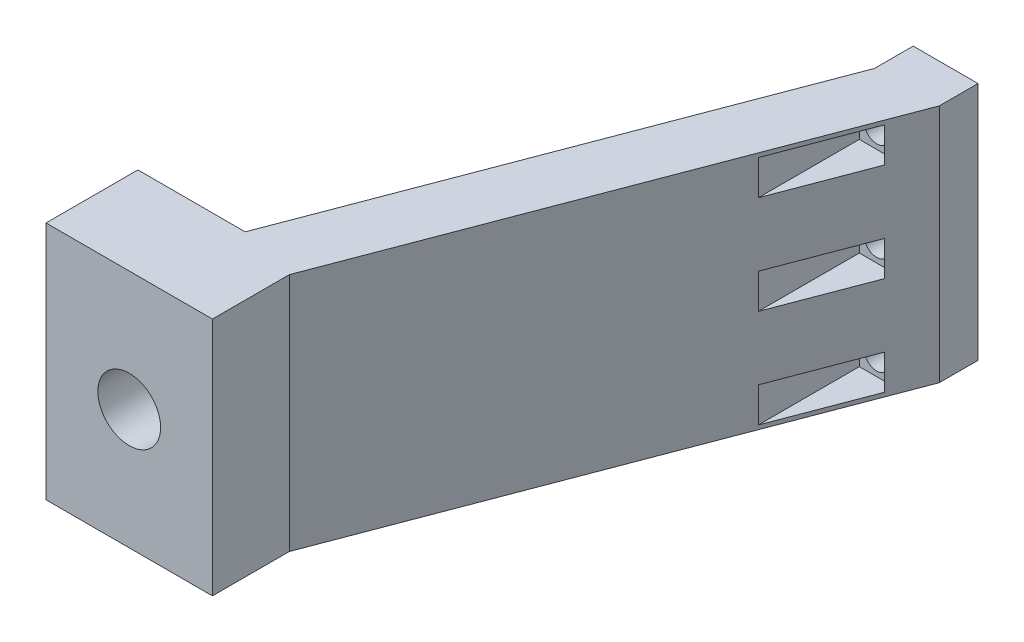
ISO-10303-21;
HEADER;
FILE_DESCRIPTION(('STEP AP214'),'2;1');
FILE_NAME('part.step','',(''),(''),'','','');
FILE_SCHEMA(('AUTOMOTIVE_DESIGN { 1 0 10303 214 1 1 1 1 }'));
ENDSEC;
DATA;
#1=APPLICATION_CONTEXT('core data for automotive mechanical design processes');
#2=APPLICATION_PROTOCOL_DEFINITION('international standard','automotive_design',2000,#1);
#3=PRODUCT_CONTEXT('',#1,'mechanical');
#4=PRODUCT('Part','Part','',(#3));
#5=PRODUCT_RELATED_PRODUCT_CATEGORY('part','',(#4));
#6=PRODUCT_DEFINITION_FORMATION('','',#4);
#7=PRODUCT_DEFINITION_CONTEXT('part definition',#1,'design');
#8=PRODUCT_DEFINITION('design','',#6,#7);
#9=PRODUCT_DEFINITION_SHAPE('','',#8);
#10=(LENGTH_UNIT() NAMED_UNIT(*) SI_UNIT(.MILLI.,.METRE.));
#11=(NAMED_UNIT(*) PLANE_ANGLE_UNIT() SI_UNIT($,.RADIAN.));
#12=(NAMED_UNIT(*) SI_UNIT($,.STERADIAN.) SOLID_ANGLE_UNIT());
#13=UNCERTAINTY_MEASURE_WITH_UNIT(LENGTH_MEASURE(1.E-05),#10,'distance_accuracy_value','');
#14=(GEOMETRIC_REPRESENTATION_CONTEXT(3) GLOBAL_UNCERTAINTY_ASSIGNED_CONTEXT((#13)) GLOBAL_UNIT_ASSIGNED_CONTEXT((#10,
#11,#12)) REPRESENTATION_CONTEXT('',''));
#15=CARTESIAN_POINT('',(0.,0.,0.));
#16=DIRECTION('',(0.,0.,1.));
#17=DIRECTION('',(1.,0.,0.));
#18=AXIS2_PLACEMENT_3D('',#15,#16,#17);
#19=CARTESIAN_POINT('',(182.027314729737,-38.1,121.14294460415));
#20=DIRECTION('',(0.,0.,1.));
#21=DIRECTION('',(1.,0.,0.));
#22=AXIS2_PLACEMENT_3D('',#19,#20,#21);
#23=CYLINDRICAL_SURFACE('',#22,3.75000000000001);
#24=CARTESIAN_POINT('',(182.027314729737,-38.1,127.74240555955));
#25=DIRECTION('',(0.,0.,-1.));
#26=DIRECTION('',(-1.,0.,0.));
#27=AXIS2_PLACEMENT_3D('',#24,#25,#26);
#28=CIRCLE('',#27,3.75000000000001);
#29=CARTESIAN_POINT('',(178.277314729737,-38.1,127.74240555955));
#30=VERTEX_POINT('',#29);
#31=EDGE_CURVE('E222',#30,#30,#28,.T.);
#32=ORIENTED_EDGE('',*,*,#31,.T.);
#33=EDGE_LOOP('',(#32));
#34=FACE_BOUND('',#33,.T.);
#35=CARTESIAN_POINT('',(182.027314729737,-38.1,131.46294460415));
#36=DIRECTION('',(0.,0.,1.));
#37=DIRECTION('',(1.,0.,0.));
#38=AXIS2_PLACEMENT_3D('',#35,#36,#37);
#39=CIRCLE('',#38,3.75000000000001);
#40=CARTESIAN_POINT('',(185.777314729737,-38.1,131.46294460415));
#41=VERTEX_POINT('',#40);
#42=EDGE_CURVE('E47',#41,#41,#39,.F.);
#43=ORIENTED_EDGE('',*,*,#42,.F.);
#44=EDGE_LOOP('',(#43));
#45=FACE_BOUND('',#44,.T.);
#46=ADVANCED_FACE('F43',(#34,#45),#23,.F.);
#47=CARTESIAN_POINT('',(249.665385215949,160.042390935063,10.));
#48=DIRECTION('',(0.934931103440882,0.,0.354829299549538));
#49=DIRECTION('',(0.354829299549538,0.,-0.934931103440882));
#50=AXIS2_PLACEMENT_3D('',#47,#48,#49);
#51=PLANE('',#50);
#52=DIRECTION('',(-0.354829299549538,0.,0.934931103440882));
#53=VECTOR('',#52,1.);
#54=CARTESIAN_POINT('',(249.665385215949,-42.5884167770716,10.));
#55=LINE('',#54,#53);
#56=CARTESIAN_POINT('',(245.788416777072,-42.5884167770716,20.2153299774481));
#57=VERTEX_POINT('',#56);
#58=CARTESIAN_POINT('',(236.811583222928,-42.5884167770716,43.8681706837683));
#59=VERTEX_POINT('',#58);
#60=EDGE_CURVE('E428',#57,#59,#55,.T.);
#61=ORIENTED_EDGE('',*,*,#60,.T.);
#62=DIRECTION('',(0.,1.,0.));
#63=VECTOR('',#62,1.);
#64=CARTESIAN_POINT('',(236.811583222928,160.042390935063,43.8681706837682));
#65=LINE('',#64,#63);
#66=CARTESIAN_POINT('',(236.811583222928,-33.6115832229283,43.8681706837683));
#67=VERTEX_POINT('',#66);
#68=EDGE_CURVE('E432',#59,#67,#65,.T.);
#69=ORIENTED_EDGE('',*,*,#68,.T.);
#70=DIRECTION('',(0.354829299549538,0.,-0.934931103440882));
#71=VECTOR('',#70,1.);
#72=CARTESIAN_POINT('',(249.665385215949,-33.6115832229283,10.));
#73=LINE('',#72,#71);
#74=CARTESIAN_POINT('',(245.788416777072,-33.6115832229283,20.2153299774481));
#75=VERTEX_POINT('',#74);
#76=EDGE_CURVE('E420',#67,#75,#73,.T.);
#77=ORIENTED_EDGE('',*,*,#76,.T.);
#78=DIRECTION('',(0.,-1.,0.));
#79=VECTOR('',#78,1.);
#80=CARTESIAN_POINT('',(245.788416777072,160.042390935063,20.2153299774481));
#81=LINE('',#80,#79);
#82=EDGE_CURVE('E424',#75,#57,#81,.T.);
#83=ORIENTED_EDGE('',*,*,#82,.T.);
#84=EDGE_LOOP('',(#61,#69,#77,#83));
#85=FACE_BOUND('',#84,.T.);
#86=DIRECTION('',(0.354829299549538,0.,-0.934931103440882));
#87=VECTOR('',#86,1.);
#88=CARTESIAN_POINT('',(249.665385215949,-7.1526177093732,10.));
#89=LINE('',#88,#87);
#90=CARTESIAN_POINT('',(203.509422764083,-7.15261770937314,131.615224448156));
#91=VERTEX_POINT('',#90);
#92=CARTESIAN_POINT('',(249.665385215949,-7.1526177093732,10.));
#93=VERTEX_POINT('',#92);
#94=EDGE_CURVE('E316',#91,#93,#89,.T.);
#95=ORIENTED_EDGE('',*,*,#94,.F.);
#96=DIRECTION('',(0.,-1.,0.));
#97=VECTOR('',#96,1.);
#98=CARTESIAN_POINT('',(203.509422764083,160.042390935063,131.615224448156));
#99=LINE('',#98,#97);
#100=CARTESIAN_POINT('',(203.509422764083,-69.0473822906268,131.615224448156));
#101=VERTEX_POINT('',#100);
#102=EDGE_CURVE('E340',#91,#101,#99,.T.);
#103=ORIENTED_EDGE('',*,*,#102,.T.);
#104=DIRECTION('',(-0.354829299549538,0.,0.934931103440882));
#105=VECTOR('',#104,1.);
#106=CARTESIAN_POINT('',(249.665385215949,-69.0473822906268,10.));
#107=LINE('',#106,#105);
#108=CARTESIAN_POINT('',(249.665385215949,-69.0473822906268,10.));
#109=VERTEX_POINT('',#108);
#110=EDGE_CURVE('E290',#109,#101,#107,.T.);
#111=ORIENTED_EDGE('',*,*,#110,.F.);
#112=DIRECTION('',(0.,1.,0.));
#113=VECTOR('',#112,1.);
#114=CARTESIAN_POINT('',(249.665385215949,-69.0473822906268,10.));
#115=LINE('',#114,#113);
#116=EDGE_CURVE('E362',#109,#93,#115,.T.);
#117=ORIENTED_EDGE('',*,*,#116,.T.);
#118=EDGE_LOOP('',(#95,#103,#111,#117));
#119=FACE_BOUND('',#118,.T.);
#120=DIRECTION('',(-0.354829299549538,0.,0.934931103440882));
#121=VECTOR('',#120,1.);
#122=CARTESIAN_POINT('',(249.665385215949,-17.1884167770716,10.));
#123=LINE('',#122,#121);
#124=CARTESIAN_POINT('',(245.788416777072,-17.1884167770716,20.2153299774481));
#125=VERTEX_POINT('',#124);
#126=CARTESIAN_POINT('',(236.811583222928,-17.1884167770716,43.8681706837683));
#127=VERTEX_POINT('',#126);
#128=EDGE_CURVE('E412',#125,#127,#123,.T.);
#129=ORIENTED_EDGE('',*,*,#128,.T.);
#130=DIRECTION('',(0.,1.,0.));
#131=VECTOR('',#130,1.);
#132=CARTESIAN_POINT('',(236.811583222928,160.042390935063,43.8681706837682));
#133=LINE('',#132,#131);
#134=CARTESIAN_POINT('',(236.811583222928,-8.21158322292831,43.8681706837683));
#135=VERTEX_POINT('',#134);
#136=EDGE_CURVE('E416',#127,#135,#133,.T.);
#137=ORIENTED_EDGE('',*,*,#136,.T.);
#138=DIRECTION('',(0.354829299549538,0.,-0.934931103440882));
#139=VECTOR('',#138,1.);
#140=CARTESIAN_POINT('',(249.665385215949,-8.21158322292831,9.99999999999999));
#141=LINE('',#140,#139);
#142=CARTESIAN_POINT('',(245.788416777072,-8.21158322292831,20.2153299774481));
#143=VERTEX_POINT('',#142);
#144=EDGE_CURVE('E394',#135,#143,#141,.T.);
#145=ORIENTED_EDGE('',*,*,#144,.T.);
#146=DIRECTION('',(0.,-1.,0.));
#147=VECTOR('',#146,1.);
#148=CARTESIAN_POINT('',(245.788416777072,160.042390935063,20.2153299774467));
#149=LINE('',#148,#147);
#150=EDGE_CURVE('E408',#143,#125,#149,.T.);
#151=ORIENTED_EDGE('',*,*,#150,.T.);
#152=EDGE_LOOP('',(#129,#137,#145,#151));
#153=FACE_BOUND('',#152,.T.);
#154=DIRECTION('',(-0.354829299549538,0.,0.934931103440882));
#155=VECTOR('',#154,1.);
#156=CARTESIAN_POINT('',(249.665385215949,-67.9884167770716,10.));
#157=LINE('',#156,#155);
#158=CARTESIAN_POINT('',(245.788416777072,-67.9884167770716,20.2153299774481));
#159=VERTEX_POINT('',#158);
#160=CARTESIAN_POINT('',(236.811583222928,-67.9884167770716,43.8681706837683));
#161=VERTEX_POINT('',#160);
#162=EDGE_CURVE('E53',#159,#161,#157,.T.);
#163=ORIENTED_EDGE('',*,*,#162,.T.);
#164=DIRECTION('',(0.,1.,0.));
#165=VECTOR('',#164,1.);
#166=CARTESIAN_POINT('',(236.811583222928,160.042390935063,43.8681706837682));
#167=LINE('',#166,#165);
#168=CARTESIAN_POINT('',(236.811583222928,-59.0115832229283,43.8681706837683));
#169=VERTEX_POINT('',#168);
#170=EDGE_CURVE('E11',#161,#169,#167,.T.);
#171=ORIENTED_EDGE('',*,*,#170,.T.);
#172=DIRECTION('',(0.354829299549538,0.,-0.934931103440882));
#173=VECTOR('',#172,1.);
#174=CARTESIAN_POINT('',(249.665385215949,-59.0115832229283,10.));
#175=LINE('',#174,#173);
#176=CARTESIAN_POINT('',(245.788416777072,-59.0115832229283,20.2153299774482));
#177=VERTEX_POINT('',#176);
#178=EDGE_CURVE('E436',#169,#177,#175,.T.);
#179=ORIENTED_EDGE('',*,*,#178,.T.);
#180=DIRECTION('',(0.,-1.,0.));
#181=VECTOR('',#180,1.);
#182=CARTESIAN_POINT('',(245.788416777071,160.042390935063,20.2153299774499));
#183=LINE('',#182,#181);
#184=EDGE_CURVE('E440',#177,#159,#183,.T.);
#185=ORIENTED_EDGE('',*,*,#184,.T.);
#186=EDGE_LOOP('',(#163,#171,#179,#185));
#187=FACE_BOUND('',#186,.T.);
#188=ADVANCED_FACE('F446',(#85,#119,#153,#187),#51,.T.);
#189=CARTESIAN_POINT('',(241.3,-38.1,151.46294460415));
#190=DIRECTION('',(0.,0.,-1.));
#191=DIRECTION('',(-1.,0.,0.));
#192=AXIS2_PLACEMENT_3D('',#189,#190,#191);
#193=CYLINDRICAL_SURFACE('',#192,3.22777378978186);
#194=CARTESIAN_POINT('',(241.3,-38.1,0.));
#195=DIRECTION('',(0.,0.,-1.));
#196=DIRECTION('',(-1.,0.,0.));
#197=AXIS2_PLACEMENT_3D('',#194,#195,#196);
#198=CIRCLE('',#197,3.22777378978186);
#199=CARTESIAN_POINT('',(238.072226210218,-38.1,0.));
#200=VERTEX_POINT('',#199);
#201=EDGE_CURVE('E291',#200,#200,#198,.T.);
#202=ORIENTED_EDGE('',*,*,#201,.T.);
#203=EDGE_LOOP('',(#202));
#204=FACE_BOUND('',#203,.T.);
#205=CARTESIAN_POINT('',(241.3,-38.1,17.78));
#206=DIRECTION('',(0.,0.,1.));
#207=DIRECTION('',(1.,0.,0.));
#208=AXIS2_PLACEMENT_3D('',#205,#206,#207);
#209=CIRCLE('',#208,3.22777378978186);
#210=CARTESIAN_POINT('',(244.527773789782,-38.1,17.78));
#211=VERTEX_POINT('',#210);
#212=EDGE_CURVE('E398',#211,#211,#209,.F.);
#213=ORIENTED_EDGE('',*,*,#212,.F.);
#214=EDGE_LOOP('',(#213));
#215=FACE_BOUND('',#214,.T.);
#216=ADVANCED_FACE('F468',(#204,#215),#193,.F.);
#217=CARTESIAN_POINT('',(241.3,-63.5,151.46294460415));
#218=DIRECTION('',(0.,0.,-1.));
#219=DIRECTION('',(-1.,0.,0.));
#220=AXIS2_PLACEMENT_3D('',#217,#218,#219);
#221=CYLINDRICAL_SURFACE('',#220,3.22777378978186);
#222=CARTESIAN_POINT('',(241.3,-63.5,0.));
#223=DIRECTION('',(0.,0.,-1.));
#224=DIRECTION('',(-1.,0.,0.));
#225=AXIS2_PLACEMENT_3D('',#222,#223,#224);
#226=CIRCLE('',#225,3.22777378978186);
#227=CARTESIAN_POINT('',(238.072226210218,-63.5,0.));
#228=VERTEX_POINT('',#227);
#229=EDGE_CURVE('E286',#228,#228,#226,.T.);
#230=ORIENTED_EDGE('',*,*,#229,.T.);
#231=EDGE_LOOP('',(#230));
#232=FACE_BOUND('',#231,.T.);
#233=CARTESIAN_POINT('',(241.3,-63.5,17.78));
#234=DIRECTION('',(0.,0.,1.));
#235=DIRECTION('',(1.,0.,0.));
#236=AXIS2_PLACEMENT_3D('',#233,#234,#235);
#237=CIRCLE('',#236,3.22777378978186);
#238=CARTESIAN_POINT('',(244.527773789782,-63.5,17.78));
#239=VERTEX_POINT('',#238);
#240=EDGE_CURVE('E197',#239,#239,#237,.F.);
#241=ORIENTED_EDGE('',*,*,#240,.F.);
#242=EDGE_LOOP('',(#241));
#243=FACE_BOUND('',#242,.T.);
#244=ADVANCED_FACE('F515',(#232,#243),#221,.F.);
#245=CARTESIAN_POINT('',(0.,0.,0.));
#246=DIRECTION('',(0.,0.,-1.));
#247=DIRECTION('',(-1.,0.,0.));
#248=AXIS2_PLACEMENT_3D('',#245,#246,#247);
#249=PLANE('',#248);
#250=ORIENTED_EDGE('',*,*,#229,.F.);
#251=EDGE_LOOP('',(#250));
#252=FACE_BOUND('',#251,.T.);
#253=ORIENTED_EDGE('',*,*,#201,.F.);
#254=EDGE_LOOP('',(#253));
#255=FACE_BOUND('',#254,.T.);
#256=CARTESIAN_POINT('',(241.3,-12.7,0.));
#257=DIRECTION('',(0.,0.,-1.));
#258=DIRECTION('',(-1.,0.,0.));
#259=AXIS2_PLACEMENT_3D('',#256,#257,#258);
#260=CIRCLE('',#259,3.22777378978186);
#261=CARTESIAN_POINT('',(238.072226210218,-12.7,0.));
#262=VERTEX_POINT('',#261);
#263=EDGE_CURVE('E295',#262,#262,#260,.T.);
#264=ORIENTED_EDGE('',*,*,#263,.F.);
#265=EDGE_LOOP('',(#264));
#266=FACE_BOUND('',#265,.T.);
#267=DIRECTION('',(0.,-1.,0.));
#268=VECTOR('',#267,1.);
#269=CARTESIAN_POINT('',(232.934614784051,-69.0473822906268,0.));
#270=LINE('',#269,#268);
#271=CARTESIAN_POINT('',(232.934614784051,-7.1526177093732,0.));
#272=VERTEX_POINT('',#271);
#273=CARTESIAN_POINT('',(232.934614784051,-69.0473822906268,0.));
#274=VERTEX_POINT('',#273);
#275=EDGE_CURVE('E357',#272,#274,#270,.T.);
#276=ORIENTED_EDGE('',*,*,#275,.F.);
#277=DIRECTION('',(-1.,0.,0.));
#278=VECTOR('',#277,1.);
#279=CARTESIAN_POINT('',(232.934614784051,-7.1526177093732,0.));
#280=LINE('',#279,#278);
#281=CARTESIAN_POINT('',(249.665385215949,-7.1526177093732,0.));
#282=VERTEX_POINT('',#281);
#283=EDGE_CURVE('E363',#282,#272,#280,.T.);
#284=ORIENTED_EDGE('',*,*,#283,.F.);
#285=DIRECTION('',(0.,1.,0.));
#286=VECTOR('',#285,1.);
#287=CARTESIAN_POINT('',(249.665385215949,-69.0473822906268,0.));
#288=LINE('',#287,#286);
#289=CARTESIAN_POINT('',(249.665385215949,-69.0473822906268,0.));
#290=VERTEX_POINT('',#289);
#291=EDGE_CURVE('E374',#290,#282,#288,.T.);
#292=ORIENTED_EDGE('',*,*,#291,.F.);
#293=DIRECTION('',(1.,0.,0.));
#294=VECTOR('',#293,1.);
#295=CARTESIAN_POINT('',(232.934614784051,-69.0473822906268,0.));
#296=LINE('',#295,#294);
#297=EDGE_CURVE('E371',#274,#290,#296,.T.);
#298=ORIENTED_EDGE('',*,*,#297,.F.);
#299=EDGE_LOOP('',(#276,#284,#292,#298));
#300=FACE_BOUND('',#299,.T.);
#301=ADVANCED_FACE('F512',(#252,#255,#266,#300),#249,.T.);
#302=CARTESIAN_POINT('',(232.934614784051,-69.0473822906268,10.));
#303=DIRECTION('',(1.,0.,0.));
#304=DIRECTION('',(0.,0.,-1.));
#305=AXIS2_PLACEMENT_3D('',#302,#303,#304);
#306=PLANE('',#305);
#307=ORIENTED_EDGE('',*,*,#275,.T.);
#308=DIRECTION('',(0.,0.,-1.));
#309=VECTOR('',#308,1.);
#310=CARTESIAN_POINT('',(232.934614784051,-69.0473822906268,10.));
#311=LINE('',#310,#309);
#312=CARTESIAN_POINT('',(232.934614784051,-69.0473822906268,10.));
#313=VERTEX_POINT('',#312);
#314=EDGE_CURVE('E390',#313,#274,#311,.T.);
#315=ORIENTED_EDGE('',*,*,#314,.F.);
#316=DIRECTION('',(0.,-1.,0.));
#317=VECTOR('',#316,1.);
#318=CARTESIAN_POINT('',(232.934614784051,-69.0473822906268,10.));
#319=LINE('',#318,#317);
#320=CARTESIAN_POINT('',(232.934614784051,-7.1526177093732,10.));
#321=VERTEX_POINT('',#320);
#322=EDGE_CURVE('E358',#321,#313,#319,.T.);
#323=ORIENTED_EDGE('',*,*,#322,.F.);
#324=DIRECTION('',(0.,0.,-1.));
#325=VECTOR('',#324,1.);
#326=CARTESIAN_POINT('',(232.934614784051,-7.1526177093732,10.));
#327=LINE('',#326,#325);
#328=EDGE_CURVE('E367',#321,#272,#327,.T.);
#329=ORIENTED_EDGE('',*,*,#328,.T.);
#330=EDGE_LOOP('',(#307,#315,#323,#329));
#331=FACE_BOUND('',#330,.T.);
#332=ADVANCED_FACE('F45',(#331),#306,.F.);
#333=CARTESIAN_POINT('',(232.934614784051,-69.0473822906268,10.));
#334=DIRECTION('',(0.,1.,0.));
#335=DIRECTION('',(0.,0.,1.));
#336=AXIS2_PLACEMENT_3D('',#333,#334,#335);
#337=PLANE('',#336);
#338=ORIENTED_EDGE('',*,*,#297,.T.);
#339=DIRECTION('',(0.,0.,-1.));
#340=VECTOR('',#339,1.);
#341=CARTESIAN_POINT('',(249.665385215949,-69.0473822906268,10.));
#342=LINE('',#341,#340);
#343=EDGE_CURVE('E386',#109,#290,#342,.T.);
#344=ORIENTED_EDGE('',*,*,#343,.F.);
#345=ORIENTED_EDGE('',*,*,#110,.T.);
#346=DIRECTION('',(0.,0.,1.));
#347=VECTOR('',#346,1.);
#348=CARTESIAN_POINT('',(203.509422764083,-69.0473822906268,131.615224448156));
#349=LINE('',#348,#347);
#350=CARTESIAN_POINT('',(203.509422764083,-69.0473822906268,151.46294460415));
#351=VERTEX_POINT('',#350);
#352=EDGE_CURVE('E320',#101,#351,#349,.T.);
#353=ORIENTED_EDGE('',*,*,#352,.T.);
#354=DIRECTION('',(-1.,0.,0.));
#355=VECTOR('',#354,1.);
#356=CARTESIAN_POINT('',(203.509422764083,-69.0473822906268,151.46294460415));
#357=LINE('',#356,#355);
#358=CARTESIAN_POINT('',(160.545206695391,-69.0473822906268,151.46294460415));
#359=VERTEX_POINT('',#358);
#360=EDGE_CURVE('E324',#351,#359,#357,.T.);
#361=ORIENTED_EDGE('',*,*,#360,.T.);
#362=DIRECTION('',(0.,0.,-1.));
#363=VECTOR('',#362,1.);
#364=CARTESIAN_POINT('',(160.545206695391,-69.0473822906268,127.74240555955));
#365=LINE('',#364,#363);
#366=CARTESIAN_POINT('',(160.545206695391,-69.0473822906268,127.74240555955));
#367=VERTEX_POINT('',#366);
#368=EDGE_CURVE('E328',#359,#367,#365,.T.);
#369=ORIENTED_EDGE('',*,*,#368,.T.);
#370=DIRECTION('',(1.,0.,0.));
#371=VECTOR('',#370,1.);
#372=CARTESIAN_POINT('',(160.545206695391,-69.0473822906268,127.74240555955));
#373=LINE('',#372,#371);
#374=CARTESIAN_POINT('',(188.248482150092,-69.0473822906268,127.74240555955));
#375=VERTEX_POINT('',#374);
#376=EDGE_CURVE('E332',#367,#375,#373,.T.);
#377=ORIENTED_EDGE('',*,*,#376,.T.);
#378=DIRECTION('',(0.354829299549538,0.,-0.934931103440881));
#379=VECTOR('',#378,1.);
#380=CARTESIAN_POINT('',(232.934614784051,-69.0473822906268,10.));
#381=LINE('',#380,#379);
#382=EDGE_CURVE('E336',#375,#313,#381,.T.);
#383=ORIENTED_EDGE('',*,*,#382,.T.);
#384=ORIENTED_EDGE('',*,*,#314,.T.);
#385=EDGE_LOOP('',(#338,#344,#345,#353,#361,#369,#377,#383,#384));
#386=FACE_BOUND('',#385,.T.);
#387=ADVANCED_FACE('F522',(#386),#337,.F.);
#388=CARTESIAN_POINT('',(249.665385215949,-69.0473822906268,10.));
#389=DIRECTION('',(-1.,0.,0.));
#390=DIRECTION('',(0.,0.,1.));
#391=AXIS2_PLACEMENT_3D('',#388,#389,#390);
#392=PLANE('',#391);
#393=ORIENTED_EDGE('',*,*,#291,.T.);
#394=DIRECTION('',(0.,0.,-1.));
#395=VECTOR('',#394,1.);
#396=CARTESIAN_POINT('',(249.665385215949,-7.1526177093732,10.));
#397=LINE('',#396,#395);
#398=EDGE_CURVE('E382',#93,#282,#397,.T.);
#399=ORIENTED_EDGE('',*,*,#398,.F.);
#400=ORIENTED_EDGE('',*,*,#116,.F.);
#401=ORIENTED_EDGE('',*,*,#343,.T.);
#402=EDGE_LOOP('',(#393,#399,#400,#401));
#403=FACE_BOUND('',#402,.T.);
#404=ADVANCED_FACE('F519',(#403),#392,.F.);
#405=CARTESIAN_POINT('',(232.934614784051,-7.1526177093732,10.));
#406=DIRECTION('',(0.,-1.,0.));
#407=DIRECTION('',(0.,0.,-1.));
#408=AXIS2_PLACEMENT_3D('',#405,#406,#407);
#409=PLANE('',#408);
#410=ORIENTED_EDGE('',*,*,#283,.T.);
#411=ORIENTED_EDGE('',*,*,#328,.F.);
#412=DIRECTION('',(-0.354829299549538,0.,0.934931103440882));
#413=VECTOR('',#412,1.);
#414=CARTESIAN_POINT('',(232.934614784051,-7.1526177093732,10.));
#415=LINE('',#414,#413);
#416=CARTESIAN_POINT('',(188.248482150092,-7.1526177093732,127.74240555955));
#417=VERTEX_POINT('',#416);
#418=EDGE_CURVE('E313',#321,#417,#415,.T.);
#419=ORIENTED_EDGE('',*,*,#418,.T.);
#420=DIRECTION('',(-1.,0.,0.));
#421=VECTOR('',#420,1.);
#422=CARTESIAN_POINT('',(160.545206695391,-7.1526177093732,127.74240555955));
#423=LINE('',#422,#421);
#424=CARTESIAN_POINT('',(160.545206695391,-7.1526177093732,127.74240555955));
#425=VERTEX_POINT('',#424);
#426=EDGE_CURVE('E310',#417,#425,#423,.T.);
#427=ORIENTED_EDGE('',*,*,#426,.T.);
#428=DIRECTION('',(0.,0.,1.));
#429=VECTOR('',#428,1.);
#430=CARTESIAN_POINT('',(160.545206695391,-7.1526177093732,127.74240555955));
#431=LINE('',#430,#429);
#432=CARTESIAN_POINT('',(160.545206695391,-7.1526177093732,151.46294460415));
#433=VERTEX_POINT('',#432);
#434=EDGE_CURVE('E307',#425,#433,#431,.T.);
#435=ORIENTED_EDGE('',*,*,#434,.T.);
#436=DIRECTION('',(1.,0.,0.));
#437=VECTOR('',#436,1.);
#438=CARTESIAN_POINT('',(203.509422764083,-7.1526177093732,151.46294460415));
#439=LINE('',#438,#437);
#440=CARTESIAN_POINT('',(203.509422764083,-7.1526177093732,151.46294460415));
#441=VERTEX_POINT('',#440);
#442=EDGE_CURVE('E303',#433,#441,#439,.T.);
#443=ORIENTED_EDGE('',*,*,#442,.T.);
#444=DIRECTION('',(0.,0.,-1.));
#445=VECTOR('',#444,1.);
#446=CARTESIAN_POINT('',(203.509422764083,-7.1526177093732,131.615224448156));
#447=LINE('',#446,#445);
#448=EDGE_CURVE('E300',#441,#91,#447,.T.);
#449=ORIENTED_EDGE('',*,*,#448,.T.);
#450=ORIENTED_EDGE('',*,*,#94,.T.);
#451=ORIENTED_EDGE('',*,*,#398,.T.);
#452=EDGE_LOOP('',(#410,#411,#419,#427,#435,#443,#449,#450,#451));
#453=FACE_BOUND('',#452,.T.);
#454=ADVANCED_FACE('F500',(#453),#409,.F.);
#455=CARTESIAN_POINT('',(232.934614784051,160.042390935063,10.));
#456=DIRECTION('',(-0.934931103440882,0.,-0.354829299549538));
#457=DIRECTION('',(-0.354829299549538,0.,0.934931103440882));
#458=AXIS2_PLACEMENT_3D('',#455,#456,#457);
#459=PLANE('',#458);
#460=ORIENTED_EDGE('',*,*,#418,.F.);
#461=ORIENTED_EDGE('',*,*,#322,.T.);
#462=ORIENTED_EDGE('',*,*,#382,.F.);
#463=DIRECTION('',(0.,-1.,0.));
#464=VECTOR('',#463,1.);
#465=CARTESIAN_POINT('',(188.248482150092,160.042390935063,127.74240555955));
#466=LINE('',#465,#464);
#467=EDGE_CURVE('E304',#417,#375,#466,.T.);
#468=ORIENTED_EDGE('',*,*,#467,.F.);
#469=EDGE_LOOP('',(#460,#461,#462,#468));
#470=FACE_BOUND('',#469,.T.);
#471=ADVANCED_FACE('F496',(#470),#459,.T.);
#472=CARTESIAN_POINT('',(160.545206695391,160.042390935063,127.74240555955));
#473=DIRECTION('',(0.,0.,-1.));
#474=DIRECTION('',(-1.,0.,0.));
#475=AXIS2_PLACEMENT_3D('',#472,#473,#474);
#476=PLANE('',#475);
#477=ORIENTED_EDGE('',*,*,#31,.F.);
#478=EDGE_LOOP('',(#477));
#479=FACE_BOUND('',#478,.T.);
#480=ORIENTED_EDGE('',*,*,#426,.F.);
#481=ORIENTED_EDGE('',*,*,#467,.T.);
#482=ORIENTED_EDGE('',*,*,#376,.F.);
#483=DIRECTION('',(0.,-1.,0.));
#484=VECTOR('',#483,1.);
#485=CARTESIAN_POINT('',(160.545206695391,160.042390935063,127.74240555955));
#486=LINE('',#485,#484);
#487=EDGE_CURVE('E343',#425,#367,#486,.T.);
#488=ORIENTED_EDGE('',*,*,#487,.F.);
#489=EDGE_LOOP('',(#480,#481,#482,#488));
#490=FACE_BOUND('',#489,.T.);
#491=ADVANCED_FACE('F499',(#479,#490),#476,.T.);
#492=CARTESIAN_POINT('',(160.545206695391,160.042390935063,127.74240555955));
#493=DIRECTION('',(-1.,0.,0.));
#494=DIRECTION('',(0.,0.,1.));
#495=AXIS2_PLACEMENT_3D('',#492,#493,#494);
#496=PLANE('',#495);
#497=ORIENTED_EDGE('',*,*,#434,.F.);
#498=ORIENTED_EDGE('',*,*,#487,.T.);
#499=ORIENTED_EDGE('',*,*,#368,.F.);
#500=DIRECTION('',(0.,-1.,0.));
#501=VECTOR('',#500,1.);
#502=CARTESIAN_POINT('',(160.545206695391,160.042390935063,151.46294460415));
#503=LINE('',#502,#501);
#504=EDGE_CURVE('E346',#433,#359,#503,.T.);
#505=ORIENTED_EDGE('',*,*,#504,.F.);
#506=EDGE_LOOP('',(#497,#498,#499,#505));
#507=FACE_BOUND('',#506,.T.);
#508=ADVANCED_FACE('F504',(#507),#496,.T.);
#509=CARTESIAN_POINT('',(203.509422764083,160.042390935063,151.46294460415));
#510=DIRECTION('',(0.,0.,1.));
#511=DIRECTION('',(1.,0.,0.));
#512=AXIS2_PLACEMENT_3D('',#509,#510,#511);
#513=PLANE('',#512);
#514=CARTESIAN_POINT('',(182.027314729737,-38.1,151.46294460415));
#515=DIRECTION('',(0.,0.,1.));
#516=DIRECTION('',(1.,0.,0.));
#517=AXIS2_PLACEMENT_3D('',#514,#515,#516);
#518=CIRCLE('',#517,8.1);
#519=CARTESIAN_POINT('',(190.127314729737,-38.1,151.46294460415));
#520=VERTEX_POINT('',#519);
#521=EDGE_CURVE('E863',#520,#520,#518,.T.);
#522=ORIENTED_EDGE('',*,*,#521,.F.);
#523=EDGE_LOOP('',(#522));
#524=FACE_BOUND('',#523,.T.);
#525=ORIENTED_EDGE('',*,*,#442,.F.);
#526=ORIENTED_EDGE('',*,*,#504,.T.);
#527=ORIENTED_EDGE('',*,*,#360,.F.);
#528=DIRECTION('',(0.,-1.,0.));
#529=VECTOR('',#528,1.);
#530=CARTESIAN_POINT('',(203.509422764083,160.042390935063,151.46294460415));
#531=LINE('',#530,#529);
#532=EDGE_CURVE('E349',#441,#351,#531,.T.);
#533=ORIENTED_EDGE('',*,*,#532,.F.);
#534=EDGE_LOOP('',(#525,#526,#527,#533));
#535=FACE_BOUND('',#534,.T.);
#536=ADVANCED_FACE('F489',(#524,#535),#513,.T.);
#537=CARTESIAN_POINT('',(203.509422764083,160.042390935063,131.615224448156));
#538=DIRECTION('',(1.,0.,0.));
#539=DIRECTION('',(0.,0.,-1.));
#540=AXIS2_PLACEMENT_3D('',#537,#538,#539);
#541=PLANE('',#540);
#542=ORIENTED_EDGE('',*,*,#448,.F.);
#543=ORIENTED_EDGE('',*,*,#532,.T.);
#544=ORIENTED_EDGE('',*,*,#352,.F.);
#545=ORIENTED_EDGE('',*,*,#102,.F.);
#546=EDGE_LOOP('',(#542,#543,#544,#545));
#547=FACE_BOUND('',#546,.T.);
#548=ADVANCED_FACE('F483',(#547),#541,.T.);
#549=CARTESIAN_POINT('',(241.3,-12.7,151.46294460415));
#550=DIRECTION('',(0.,0.,-1.));
#551=DIRECTION('',(-1.,0.,0.));
#552=AXIS2_PLACEMENT_3D('',#549,#550,#551);
#553=CYLINDRICAL_SURFACE('',#552,3.22777378978186);
#554=CARTESIAN_POINT('',(241.3,-12.7,17.78));
#555=DIRECTION('',(0.,0.,-1.));
#556=DIRECTION('',(-1.,0.,0.));
#557=AXIS2_PLACEMENT_3D('',#554,#555,#556);
#558=CIRCLE('',#557,3.22777378978186);
#559=CARTESIAN_POINT('',(238.072226210218,-12.7,17.78));
#560=VERTEX_POINT('',#559);
#561=EDGE_CURVE('E299',#560,#560,#558,.F.);
#562=ORIENTED_EDGE('',*,*,#561,.T.);
#563=EDGE_LOOP('',(#562));
#564=FACE_BOUND('',#563,.T.);
#565=ORIENTED_EDGE('',*,*,#263,.T.);
#566=EDGE_LOOP('',(#565));
#567=FACE_BOUND('',#566,.T.);
#568=ADVANCED_FACE('F477',(#564,#567),#553,.F.);
#569=CARTESIAN_POINT('',(0.,0.,17.78));
#570=DIRECTION('',(0.,0.,1.));
#571=DIRECTION('',(1.,0.,0.));
#572=AXIS2_PLACEMENT_3D('',#569,#570,#571);
#573=PLANE('',#572);
#574=DIRECTION('',(0.,-1.,0.));
#575=VECTOR('',#574,1.);
#576=CARTESIAN_POINT('',(236.811583222928,-67.9884167770716,17.78));
#577=LINE('',#576,#575);
#578=CARTESIAN_POINT('',(236.811583222928,-59.0115832229283,17.78));
#579=VERTEX_POINT('',#578);
#580=CARTESIAN_POINT('',(236.811583222928,-67.9884167770716,17.78));
#581=VERTEX_POINT('',#580);
#582=EDGE_CURVE('E193',#579,#581,#577,.T.);
#583=ORIENTED_EDGE('',*,*,#582,.T.);
#584=DIRECTION('',(1.,0.,0.));
#585=VECTOR('',#584,1.);
#586=CARTESIAN_POINT('',(245.788416777072,-67.9884167770716,17.78));
#587=LINE('',#586,#585);
#588=CARTESIAN_POINT('',(245.788416777072,-67.9884167770716,17.78));
#589=VERTEX_POINT('',#588);
#590=EDGE_CURVE('E201',#581,#589,#587,.T.);
#591=ORIENTED_EDGE('',*,*,#590,.T.);
#592=DIRECTION('',(0.,1.,0.));
#593=VECTOR('',#592,1.);
#594=CARTESIAN_POINT('',(245.788416777072,-67.9884167770716,17.78));
#595=LINE('',#594,#593);
#596=CARTESIAN_POINT('',(245.788416777072,-59.0115832229283,17.78));
#597=VERTEX_POINT('',#596);
#598=EDGE_CURVE('E208',#589,#597,#595,.T.);
#599=ORIENTED_EDGE('',*,*,#598,.T.);
#600=DIRECTION('',(-1.,0.,0.));
#601=VECTOR('',#600,1.);
#602=CARTESIAN_POINT('',(245.788416777072,-59.0115832229283,17.78));
#603=LINE('',#602,#601);
#604=EDGE_CURVE('E213',#597,#579,#603,.T.);
#605=ORIENTED_EDGE('',*,*,#604,.T.);
#606=EDGE_LOOP('',(#583,#591,#599,#605));
#607=FACE_BOUND('',#606,.T.);
#608=ORIENTED_EDGE('',*,*,#240,.T.);
#609=EDGE_LOOP('',(#608));
#610=FACE_BOUND('',#609,.T.);
#611=ADVANCED_FACE('F211',(#607,#610),#573,.T.);
#612=CARTESIAN_POINT('',(236.811583222928,-67.9884167770716,48.1));
#613=DIRECTION('',(1.,0.,0.));
#614=DIRECTION('',(0.,0.,-1.));
#615=AXIS2_PLACEMENT_3D('',#612,#613,#614);
#616=PLANE('',#615);
#617=DIRECTION('',(0.,0.,-1.));
#618=VECTOR('',#617,1.);
#619=CARTESIAN_POINT('',(236.811583222928,-67.9884167770716,48.1));
#620=LINE('',#619,#618);
#621=EDGE_CURVE('E188',#161,#581,#620,.T.);
#622=ORIENTED_EDGE('',*,*,#621,.T.);
#623=ORIENTED_EDGE('',*,*,#582,.F.);
#624=DIRECTION('',(0.,0.,-1.));
#625=VECTOR('',#624,1.);
#626=CARTESIAN_POINT('',(236.811583222928,-59.0115832229283,48.1));
#627=LINE('',#626,#625);
#628=EDGE_CURVE('E229',#169,#579,#627,.T.);
#629=ORIENTED_EDGE('',*,*,#628,.F.);
#630=ORIENTED_EDGE('',*,*,#170,.F.);
#631=EDGE_LOOP('',(#622,#623,#629,#630));
#632=FACE_BOUND('',#631,.T.);
#633=ADVANCED_FACE('F190',(#632),#616,.T.);
#634=CARTESIAN_POINT('',(245.788416777072,-67.9884167770716,48.1));
#635=DIRECTION('',(0.,1.,0.));
#636=DIRECTION('',(0.,0.,1.));
#637=AXIS2_PLACEMENT_3D('',#634,#635,#636);
#638=PLANE('',#637);
#639=DIRECTION('',(0.,0.,-1.));
#640=VECTOR('',#639,1.);
#641=CARTESIAN_POINT('',(245.788416777072,-67.9884167770716,48.1));
#642=LINE('',#641,#640);
#643=EDGE_CURVE('E198',#159,#589,#642,.T.);
#644=ORIENTED_EDGE('',*,*,#643,.T.);
#645=ORIENTED_EDGE('',*,*,#590,.F.);
#646=ORIENTED_EDGE('',*,*,#621,.F.);
#647=ORIENTED_EDGE('',*,*,#162,.F.);
#648=EDGE_LOOP('',(#644,#645,#646,#647));
#649=FACE_BOUND('',#648,.T.);
#650=ADVANCED_FACE('F202',(#649),#638,.T.);
#651=CARTESIAN_POINT('',(245.788416777072,-67.9884167770716,48.1));
#652=DIRECTION('',(-1.,0.,0.));
#653=DIRECTION('',(0.,-1.,0.));
#654=AXIS2_PLACEMENT_3D('',#651,#652,#653);
#655=PLANE('',#654);
#656=DIRECTION('',(0.,0.,-1.));
#657=VECTOR('',#656,1.);
#658=CARTESIAN_POINT('',(245.788416777072,-59.0115832229283,48.1));
#659=LINE('',#658,#657);
#660=EDGE_CURVE('E60',#177,#597,#659,.T.);
#661=ORIENTED_EDGE('',*,*,#660,.T.);
#662=ORIENTED_EDGE('',*,*,#598,.F.);
#663=ORIENTED_EDGE('',*,*,#643,.F.);
#664=ORIENTED_EDGE('',*,*,#184,.F.);
#665=EDGE_LOOP('',(#661,#662,#663,#664));
#666=FACE_BOUND('',#665,.T.);
#667=ADVANCED_FACE('F448',(#666),#655,.T.);
#668=CARTESIAN_POINT('',(245.788416777072,-59.0115832229283,48.1));
#669=DIRECTION('',(0.,-1.,0.));
#670=DIRECTION('',(0.,0.,-1.));
#671=AXIS2_PLACEMENT_3D('',#668,#669,#670);
#672=PLANE('',#671);
#673=ORIENTED_EDGE('',*,*,#628,.T.);
#674=ORIENTED_EDGE('',*,*,#604,.F.);
#675=ORIENTED_EDGE('',*,*,#660,.F.);
#676=ORIENTED_EDGE('',*,*,#178,.F.);
#677=EDGE_LOOP('',(#673,#674,#675,#676));
#678=FACE_BOUND('',#677,.T.);
#679=ADVANCED_FACE('F449',(#678),#672,.T.);
#680=CARTESIAN_POINT('',(0.,0.,17.78));
#681=DIRECTION('',(0.,0.,1.));
#682=DIRECTION('',(1.,0.,0.));
#683=AXIS2_PLACEMENT_3D('',#680,#681,#682);
#684=PLANE('',#683);
#685=DIRECTION('',(0.,-1.,0.));
#686=VECTOR('',#685,1.);
#687=CARTESIAN_POINT('',(236.811583222928,-42.5884167770716,17.78));
#688=LINE('',#687,#686);
#689=CARTESIAN_POINT('',(236.811583222928,-33.6115832229283,17.78));
#690=VERTEX_POINT('',#689);
#691=CARTESIAN_POINT('',(236.811583222928,-42.5884167770716,17.78));
#692=VERTEX_POINT('',#691);
#693=EDGE_CURVE('E215',#690,#692,#688,.T.);
#694=ORIENTED_EDGE('',*,*,#693,.T.);
#695=DIRECTION('',(1.,0.,0.));
#696=VECTOR('',#695,1.);
#697=CARTESIAN_POINT('',(245.788416777072,-42.5884167770716,17.78));
#698=LINE('',#697,#696);
#699=CARTESIAN_POINT('',(245.788416777072,-42.5884167770716,17.78));
#700=VERTEX_POINT('',#699);
#701=EDGE_CURVE('E219',#692,#700,#698,.T.);
#702=ORIENTED_EDGE('',*,*,#701,.T.);
#703=DIRECTION('',(0.,1.,0.));
#704=VECTOR('',#703,1.);
#705=CARTESIAN_POINT('',(245.788416777072,-42.5884167770716,17.78));
#706=LINE('',#705,#704);
#707=CARTESIAN_POINT('',(245.788416777072,-33.6115832229283,17.78));
#708=VERTEX_POINT('',#707);
#709=EDGE_CURVE('E252',#700,#708,#706,.T.);
#710=ORIENTED_EDGE('',*,*,#709,.T.);
#711=DIRECTION('',(-1.,0.,0.));
#712=VECTOR('',#711,1.);
#713=CARTESIAN_POINT('',(245.788416777072,-33.6115832229283,17.78));
#714=LINE('',#713,#712);
#715=EDGE_CURVE('E248',#708,#690,#714,.T.);
#716=ORIENTED_EDGE('',*,*,#715,.T.);
#717=EDGE_LOOP('',(#694,#702,#710,#716));
#718=FACE_BOUND('',#717,.T.);
#719=ORIENTED_EDGE('',*,*,#212,.T.);
#720=EDGE_LOOP('',(#719));
#721=FACE_BOUND('',#720,.T.);
#722=ADVANCED_FACE('F451',(#718,#721),#684,.T.);
#723=CARTESIAN_POINT('',(236.811583222928,-42.5884167770716,48.1));
#724=DIRECTION('',(1.,0.,0.));
#725=DIRECTION('',(0.,0.,-1.));
#726=AXIS2_PLACEMENT_3D('',#723,#724,#725);
#727=PLANE('',#726);
#728=DIRECTION('',(0.,0.,-1.));
#729=VECTOR('',#728,1.);
#730=CARTESIAN_POINT('',(236.811583222928,-42.5884167770716,48.1));
#731=LINE('',#730,#729);
#732=EDGE_CURVE('E236',#59,#692,#731,.T.);
#733=ORIENTED_EDGE('',*,*,#732,.T.);
#734=ORIENTED_EDGE('',*,*,#693,.F.);
#735=DIRECTION('',(0.,0.,-1.));
#736=VECTOR('',#735,1.);
#737=CARTESIAN_POINT('',(236.811583222928,-33.6115832229283,48.1));
#738=LINE('',#737,#736);
#739=EDGE_CURVE('E245',#67,#690,#738,.T.);
#740=ORIENTED_EDGE('',*,*,#739,.F.);
#741=ORIENTED_EDGE('',*,*,#68,.F.);
#742=EDGE_LOOP('',(#733,#734,#740,#741));
#743=FACE_BOUND('',#742,.T.);
#744=ADVANCED_FACE('F457',(#743),#727,.T.);
#745=CARTESIAN_POINT('',(245.788416777072,-42.5884167770716,48.1));
#746=DIRECTION('',(0.,1.,0.));
#747=DIRECTION('',(0.,0.,1.));
#748=AXIS2_PLACEMENT_3D('',#745,#746,#747);
#749=PLANE('',#748);
#750=DIRECTION('',(0.,0.,-1.));
#751=VECTOR('',#750,1.);
#752=CARTESIAN_POINT('',(245.788416777072,-42.5884167770716,48.1));
#753=LINE('',#752,#751);
#754=EDGE_CURVE('E239',#57,#700,#753,.T.);
#755=ORIENTED_EDGE('',*,*,#754,.T.);
#756=ORIENTED_EDGE('',*,*,#701,.F.);
#757=ORIENTED_EDGE('',*,*,#732,.F.);
#758=ORIENTED_EDGE('',*,*,#60,.F.);
#759=EDGE_LOOP('',(#755,#756,#757,#758));
#760=FACE_BOUND('',#759,.T.);
#761=ADVANCED_FACE('F762',(#760),#749,.T.);
#762=CARTESIAN_POINT('',(245.788416777072,-42.5884167770716,48.1));
#763=DIRECTION('',(-1.,0.,0.));
#764=DIRECTION('',(0.,0.,1.));
#765=AXIS2_PLACEMENT_3D('',#762,#763,#764);
#766=PLANE('',#765);
#767=DIRECTION('',(0.,0.,-1.));
#768=VECTOR('',#767,1.);
#769=CARTESIAN_POINT('',(245.788416777072,-33.6115832229283,48.1));
#770=LINE('',#769,#768);
#771=EDGE_CURVE('E68',#75,#708,#770,.T.);
#772=ORIENTED_EDGE('',*,*,#771,.T.);
#773=ORIENTED_EDGE('',*,*,#709,.F.);
#774=ORIENTED_EDGE('',*,*,#754,.F.);
#775=ORIENTED_EDGE('',*,*,#82,.F.);
#776=EDGE_LOOP('',(#772,#773,#774,#775));
#777=FACE_BOUND('',#776,.T.);
#778=ADVANCED_FACE('F773',(#777),#766,.T.);
#779=CARTESIAN_POINT('',(245.788416777072,-33.6115832229283,48.1));
#780=DIRECTION('',(0.,-1.,0.));
#781=DIRECTION('',(0.,0.,-1.));
#782=AXIS2_PLACEMENT_3D('',#779,#780,#781);
#783=PLANE('',#782);
#784=ORIENTED_EDGE('',*,*,#739,.T.);
#785=ORIENTED_EDGE('',*,*,#715,.F.);
#786=ORIENTED_EDGE('',*,*,#771,.F.);
#787=ORIENTED_EDGE('',*,*,#76,.F.);
#788=EDGE_LOOP('',(#784,#785,#786,#787));
#789=FACE_BOUND('',#788,.T.);
#790=ADVANCED_FACE('F583',(#789),#783,.T.);
#791=CARTESIAN_POINT('',(0.,0.,17.78));
#792=DIRECTION('',(0.,0.,-1.));
#793=DIRECTION('',(-1.,0.,0.));
#794=AXIS2_PLACEMENT_3D('',#791,#792,#793);
#795=PLANE('',#794);
#796=DIRECTION('',(0.,-1.,0.));
#797=VECTOR('',#796,1.);
#798=CARTESIAN_POINT('',(236.811583222928,-8.2115832229283,17.78));
#799=LINE('',#798,#797);
#800=CARTESIAN_POINT('',(236.811583222928,-8.2115832229283,17.78));
#801=VERTEX_POINT('',#800);
#802=CARTESIAN_POINT('',(236.811583222928,-17.1884167770716,17.78));
#803=VERTEX_POINT('',#802);
#804=EDGE_CURVE('E240',#801,#803,#799,.T.);
#805=ORIENTED_EDGE('',*,*,#804,.T.);
#806=DIRECTION('',(1.,0.,0.));
#807=VECTOR('',#806,1.);
#808=CARTESIAN_POINT('',(245.788416777072,-17.1884167770716,17.78));
#809=LINE('',#808,#807);
#810=CARTESIAN_POINT('',(245.788416777072,-17.1884167770716,17.78));
#811=VERTEX_POINT('',#810);
#812=EDGE_CURVE('E279',#803,#811,#809,.T.);
#813=ORIENTED_EDGE('',*,*,#812,.T.);
#814=DIRECTION('',(0.,1.,0.));
#815=VECTOR('',#814,1.);
#816=CARTESIAN_POINT('',(245.788416777072,-8.2115832229283,17.78));
#817=LINE('',#816,#815);
#818=CARTESIAN_POINT('',(245.788416777072,-8.2115832229283,17.78));
#819=VERTEX_POINT('',#818);
#820=EDGE_CURVE('E275',#811,#819,#817,.T.);
#821=ORIENTED_EDGE('',*,*,#820,.T.);
#822=DIRECTION('',(-1.,0.,0.));
#823=VECTOR('',#822,1.);
#824=CARTESIAN_POINT('',(245.788416777072,-8.2115832229283,17.78));
#825=LINE('',#824,#823);
#826=EDGE_CURVE('E271',#819,#801,#825,.T.);
#827=ORIENTED_EDGE('',*,*,#826,.T.);
#828=EDGE_LOOP('',(#805,#813,#821,#827));
#829=FACE_BOUND('',#828,.T.);
#830=ORIENTED_EDGE('',*,*,#561,.F.);
#831=EDGE_LOOP('',(#830));
#832=FACE_BOUND('',#831,.T.);
#833=ADVANCED_FACE('F568',(#829,#832),#795,.F.);
#834=CARTESIAN_POINT('',(236.811583222928,-8.2115832229283,48.1));
#835=DIRECTION('',(1.,0.,0.));
#836=DIRECTION('',(0.,0.,-1.));
#837=AXIS2_PLACEMENT_3D('',#834,#835,#836);
#838=PLANE('',#837);
#839=DIRECTION('',(0.,0.,-1.));
#840=VECTOR('',#839,1.);
#841=CARTESIAN_POINT('',(236.811583222928,-17.1884167770716,48.1));
#842=LINE('',#841,#840);
#843=EDGE_CURVE('E259',#127,#803,#842,.T.);
#844=ORIENTED_EDGE('',*,*,#843,.T.);
#845=ORIENTED_EDGE('',*,*,#804,.F.);
#846=DIRECTION('',(0.,0.,-1.));
#847=VECTOR('',#846,1.);
#848=CARTESIAN_POINT('',(236.811583222928,-8.2115832229283,48.1));
#849=LINE('',#848,#847);
#850=EDGE_CURVE('E268',#135,#801,#849,.T.);
#851=ORIENTED_EDGE('',*,*,#850,.F.);
#852=ORIENTED_EDGE('',*,*,#136,.F.);
#853=EDGE_LOOP('',(#844,#845,#851,#852));
#854=FACE_BOUND('',#853,.T.);
#855=ADVANCED_FACE('F575',(#854),#838,.T.);
#856=CARTESIAN_POINT('',(245.788416777072,-17.1884167770716,48.1));
#857=DIRECTION('',(0.,1.,0.));
#858=DIRECTION('',(0.,0.,1.));
#859=AXIS2_PLACEMENT_3D('',#856,#857,#858);
#860=PLANE('',#859);
#861=DIRECTION('',(0.,0.,-1.));
#862=VECTOR('',#861,1.);
#863=CARTESIAN_POINT('',(245.788416777072,-17.1884167770716,48.1));
#864=LINE('',#863,#862);
#865=EDGE_CURVE('E262',#125,#811,#864,.T.);
#866=ORIENTED_EDGE('',*,*,#865,.T.);
#867=ORIENTED_EDGE('',*,*,#812,.F.);
#868=ORIENTED_EDGE('',*,*,#843,.F.);
#869=ORIENTED_EDGE('',*,*,#128,.F.);
#870=EDGE_LOOP('',(#866,#867,#868,#869));
#871=FACE_BOUND('',#870,.T.);
#872=ADVANCED_FACE('F561',(#871),#860,.T.);
#873=CARTESIAN_POINT('',(245.788416777072,-8.2115832229283,48.1));
#874=DIRECTION('',(-1.,0.,0.));
#875=DIRECTION('',(0.,-1.,0.));
#876=AXIS2_PLACEMENT_3D('',#873,#874,#875);
#877=PLANE('',#876);
#878=DIRECTION('',(0.,0.,-1.));
#879=VECTOR('',#878,1.);
#880=CARTESIAN_POINT('',(245.788416777072,-8.2115832229283,48.1));
#881=LINE('',#880,#879);
#882=EDGE_CURVE('E265',#143,#819,#881,.T.);
#883=ORIENTED_EDGE('',*,*,#882,.T.);
#884=ORIENTED_EDGE('',*,*,#820,.F.);
#885=ORIENTED_EDGE('',*,*,#865,.F.);
#886=ORIENTED_EDGE('',*,*,#150,.F.);
#887=EDGE_LOOP('',(#883,#884,#885,#886));
#888=FACE_BOUND('',#887,.T.);
#889=ADVANCED_FACE('F565',(#888),#877,.T.);
#890=CARTESIAN_POINT('',(245.788416777072,-8.2115832229283,48.1));
#891=DIRECTION('',(0.,-1.,0.));
#892=DIRECTION('',(1.,0.,0.));
#893=AXIS2_PLACEMENT_3D('',#890,#891,#892);
#894=PLANE('',#893);
#895=ORIENTED_EDGE('',*,*,#850,.T.);
#896=ORIENTED_EDGE('',*,*,#826,.F.);
#897=ORIENTED_EDGE('',*,*,#882,.F.);
#898=ORIENTED_EDGE('',*,*,#144,.F.);
#899=EDGE_LOOP('',(#895,#896,#897,#898));
#900=FACE_BOUND('',#899,.T.);
#901=ADVANCED_FACE('F572',(#900),#894,.T.);
#902=CARTESIAN_POINT('',(182.027314729737,-38.1,131.46294460415));
#903=DIRECTION('',(0.,0.,1.));
#904=DIRECTION('',(1.,0.,0.));
#905=AXIS2_PLACEMENT_3D('',#902,#903,#904);
#906=PLANE('',#905);
#907=CARTESIAN_POINT('',(182.027314729737,-38.1,131.46294460415));
#908=DIRECTION('',(0.,0.,1.));
#909=DIRECTION('',(1.,0.,0.));
#910=AXIS2_PLACEMENT_3D('',#907,#908,#909);
#911=CIRCLE('',#910,8.1);
#912=CARTESIAN_POINT('',(190.127314729737,-38.1,131.46294460415));
#913=VERTEX_POINT('',#912);
#914=EDGE_CURVE('E860',#913,#913,#911,.T.);
#915=ORIENTED_EDGE('',*,*,#914,.T.);
#916=EDGE_LOOP('',(#915));
#917=FACE_BOUND('',#916,.T.);
#918=ORIENTED_EDGE('',*,*,#42,.T.);
#919=EDGE_LOOP('',(#918));
#920=FACE_BOUND('',#919,.T.);
#921=ADVANCED_FACE('F590',(#917,#920),#906,.T.);
#922=CARTESIAN_POINT('',(182.027314729737,-38.1,131.46294460415));
#923=DIRECTION('',(0.,0.,1.));
#924=DIRECTION('',(1.,0.,0.));
#925=AXIS2_PLACEMENT_3D('',#922,#923,#924);
#926=CYLINDRICAL_SURFACE('',#925,8.1);
#927=ORIENTED_EDGE('',*,*,#914,.F.);
#928=EDGE_LOOP('',(#927));
#929=FACE_BOUND('',#928,.T.);
#930=ORIENTED_EDGE('',*,*,#521,.T.);
#931=EDGE_LOOP('',(#930));
#932=FACE_BOUND('',#931,.T.);
#933=ADVANCED_FACE('F474',(#929,#932),#926,.F.);
#934=CLOSED_SHELL('',(#46,#188,#216,#244,#301,#332,#387,#404,#454,#471,#491,#508,#536,#548,#568,
#611,#633,#650,#667,#679,#722,#744,#761,#778,#790,#833,#855,#872,#889,#901,#921,#933));
#935=MANIFOLD_SOLID_BREP('B2',#934);
#936=ADVANCED_BREP_SHAPE_REPRESENTATION('',(#18,#935),#14);
#937=SHAPE_DEFINITION_REPRESENTATION(#9,#936);
ENDSEC;
END-ISO-10303-21;
